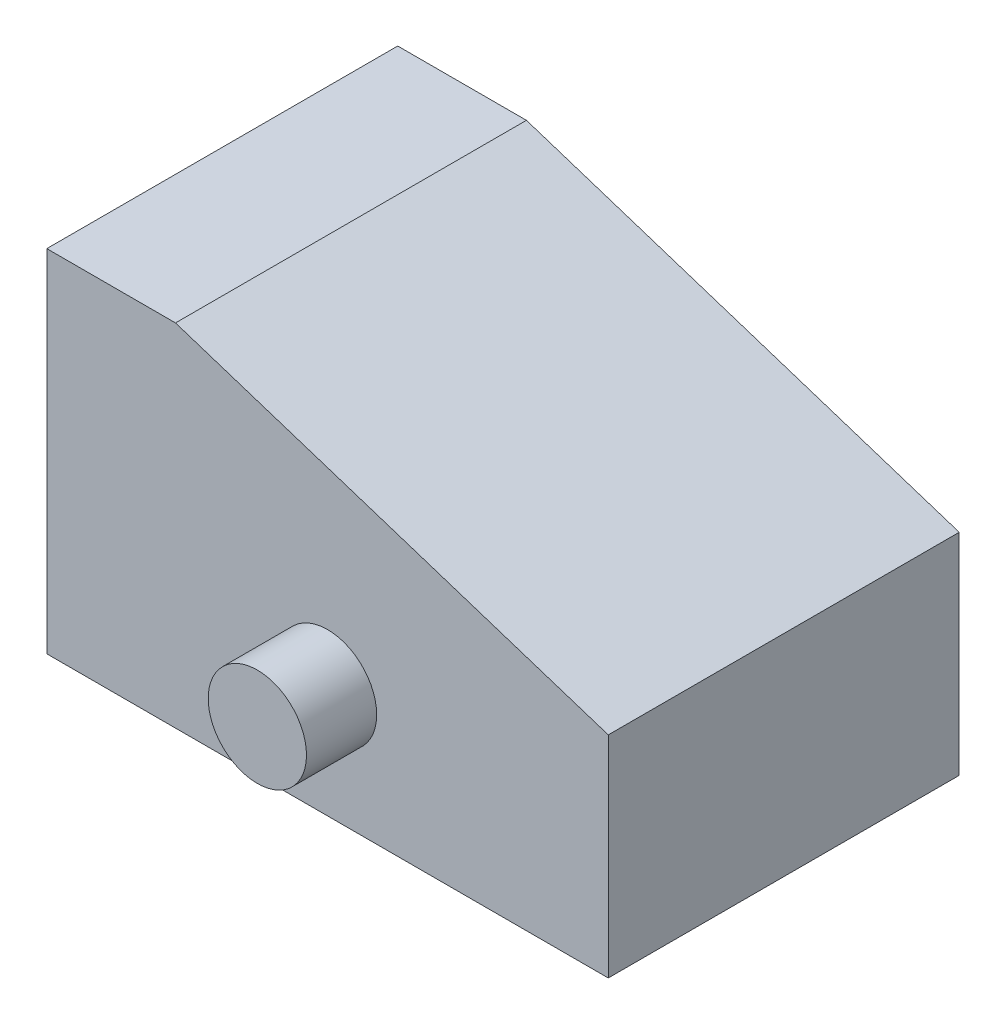
ISO-10303-21;
HEADER;
FILE_DESCRIPTION(('STEP AP214'),'2;1');
FILE_NAME('part.step','',(''),(''),'','','');
FILE_SCHEMA(('AUTOMOTIVE_DESIGN { 1 0 10303 214 1 1 1 1 }'));
ENDSEC;
DATA;
#1=APPLICATION_CONTEXT('core data for automotive mechanical design processes');
#2=APPLICATION_PROTOCOL_DEFINITION('international standard','automotive_design',2000,#1);
#3=PRODUCT_CONTEXT('',#1,'mechanical');
#4=PRODUCT('Part','Part','',(#3));
#5=PRODUCT_RELATED_PRODUCT_CATEGORY('part','',(#4));
#6=PRODUCT_DEFINITION_FORMATION('','',#4);
#7=PRODUCT_DEFINITION_CONTEXT('part definition',#1,'design');
#8=PRODUCT_DEFINITION('design','',#6,#7);
#9=PRODUCT_DEFINITION_SHAPE('','',#8);
#10=(LENGTH_UNIT() NAMED_UNIT(*) SI_UNIT(.MILLI.,.METRE.));
#11=(NAMED_UNIT(*) PLANE_ANGLE_UNIT() SI_UNIT($,.RADIAN.));
#12=(NAMED_UNIT(*) SI_UNIT($,.STERADIAN.) SOLID_ANGLE_UNIT());
#13=UNCERTAINTY_MEASURE_WITH_UNIT(LENGTH_MEASURE(1.E-05),#10,'distance_accuracy_value','');
#14=(GEOMETRIC_REPRESENTATION_CONTEXT(3) GLOBAL_UNCERTAINTY_ASSIGNED_CONTEXT((#13)) GLOBAL_UNIT_ASSIGNED_CONTEXT((#10,
#11,#12)) REPRESENTATION_CONTEXT('',''));
#15=CARTESIAN_POINT('',(0.,0.,0.));
#16=DIRECTION('',(0.,0.,1.));
#17=DIRECTION('',(1.,0.,0.));
#18=AXIS2_PLACEMENT_3D('',#15,#16,#17);
#19=CARTESIAN_POINT('',(0.,15.,0.));
#20=DIRECTION('',(1.,0.,0.));
#21=DIRECTION('',(0.,0.,-1.));
#22=AXIS2_PLACEMENT_3D('',#19,#20,#21);
#23=PLANE('',#22);
#24=DIRECTION('',(0.,0.,1.));
#25=VECTOR('',#24,1.);
#26=CARTESIAN_POINT('',(0.,0.,0.));
#27=LINE('',#26,#25);
#28=CARTESIAN_POINT('',(0.,0.,0.));
#29=VERTEX_POINT('',#28);
#30=CARTESIAN_POINT('',(0.,0.,25.));
#31=VERTEX_POINT('',#30);
#32=EDGE_CURVE('E177',#29,#31,#27,.T.);
#33=ORIENTED_EDGE('',*,*,#32,.T.);
#34=DIRECTION('',(0.,-1.,0.));
#35=VECTOR('',#34,1.);
#36=CARTESIAN_POINT('',(0.,15.,25.));
#37=LINE('',#36,#35);
#38=CARTESIAN_POINT('',(0.,25.,25.));
#39=VERTEX_POINT('',#38);
#40=EDGE_CURVE('E192',#39,#31,#37,.T.);
#41=ORIENTED_EDGE('',*,*,#40,.F.);
#42=DIRECTION('',(0.,0.,1.));
#43=VECTOR('',#42,1.);
#44=CARTESIAN_POINT('',(0.,25.,0.));
#45=LINE('',#44,#43);
#46=CARTESIAN_POINT('',(0.,25.,0.));
#47=VERTEX_POINT('',#46);
#48=EDGE_CURVE('E161',#47,#39,#45,.T.);
#49=ORIENTED_EDGE('',*,*,#48,.F.);
#50=DIRECTION('',(0.,-1.,0.));
#51=VECTOR('',#50,1.);
#52=CARTESIAN_POINT('',(0.,15.,0.));
#53=LINE('',#52,#51);
#54=EDGE_CURVE('E174',#47,#29,#53,.T.);
#55=ORIENTED_EDGE('',*,*,#54,.T.);
#56=EDGE_LOOP('',(#33,#41,#49,#55));
#57=FACE_BOUND('',#56,.T.);
#58=ADVANCED_FACE('F104',(#57),#23,.F.);
#59=CARTESIAN_POINT('',(0.,15.,25.));
#60=DIRECTION('',(0.,0.,-1.));
#61=DIRECTION('',(-1.,0.,0.));
#62=AXIS2_PLACEMENT_3D('',#59,#60,#61);
#63=PLANE('',#62);
#64=CARTESIAN_POINT('',(20.,8.,25.));
#65=DIRECTION('',(0.,0.,1.));
#66=DIRECTION('',(1.,0.,0.));
#67=AXIS2_PLACEMENT_3D('',#64,#65,#66);
#68=CIRCLE('',#67,3.5);
#69=CARTESIAN_POINT('',(23.5,8.,25.));
#70=VERTEX_POINT('',#69);
#71=EDGE_CURVE('E12',#70,#70,#68,.T.);
#72=ORIENTED_EDGE('',*,*,#71,.F.);
#73=EDGE_LOOP('',(#72));
#74=FACE_BOUND('',#73,.T.);
#75=DIRECTION('',(0.,-1.,0.));
#76=VECTOR('',#75,1.);
#77=CARTESIAN_POINT('',(40.,15.,25.));
#78=LINE('',#77,#76);
#79=CARTESIAN_POINT('',(40.,15.,25.));
#80=VERTEX_POINT('',#79);
#81=CARTESIAN_POINT('',(40.,0.,25.));
#82=VERTEX_POINT('',#81);
#83=EDGE_CURVE('E189',#80,#82,#78,.T.);
#84=ORIENTED_EDGE('',*,*,#83,.F.);
#85=DIRECTION('',(0.951214387347658,-0.308530694263667,0.));
#86=VECTOR('',#85,1.);
#87=CARTESIAN_POINT('',(24.5847689543855,20.,25.));
#88=LINE('',#87,#86);
#89=CARTESIAN_POINT('',(9.16953790877093,25.,25.));
#90=VERTEX_POINT('',#89);
#91=EDGE_CURVE('E165',#90,#80,#88,.T.);
#92=ORIENTED_EDGE('',*,*,#91,.F.);
#93=DIRECTION('',(1.,0.,0.));
#94=VECTOR('',#93,1.);
#95=CARTESIAN_POINT('',(0.,25.,25.));
#96=LINE('',#95,#94);
#97=EDGE_CURVE('E175',#39,#90,#96,.T.);
#98=ORIENTED_EDGE('',*,*,#97,.F.);
#99=ORIENTED_EDGE('',*,*,#40,.T.);
#100=DIRECTION('',(1.,0.,0.));
#101=VECTOR('',#100,1.);
#102=CARTESIAN_POINT('',(0.,0.,25.));
#103=LINE('',#102,#101);
#104=EDGE_CURVE('E176',#31,#82,#103,.T.);
#105=ORIENTED_EDGE('',*,*,#104,.T.);
#106=EDGE_LOOP('',(#84,#92,#98,#99,#105));
#107=FACE_BOUND('',#106,.T.);
#108=ADVANCED_FACE('F211',(#74,#107),#63,.F.);
#109=CARTESIAN_POINT('',(40.,15.,0.));
#110=DIRECTION('',(-1.,0.,0.));
#111=DIRECTION('',(0.,0.,1.));
#112=AXIS2_PLACEMENT_3D('',#109,#110,#111);
#113=PLANE('',#112);
#114=DIRECTION('',(0.,0.,-1.));
#115=VECTOR('',#114,1.);
#116=CARTESIAN_POINT('',(40.,0.,0.));
#117=LINE('',#116,#115);
#118=CARTESIAN_POINT('',(40.,0.,0.));
#119=VERTEX_POINT('',#118);
#120=EDGE_CURVE('E126',#82,#119,#117,.T.);
#121=ORIENTED_EDGE('',*,*,#120,.T.);
#122=DIRECTION('',(0.,-1.,0.));
#123=VECTOR('',#122,1.);
#124=CARTESIAN_POINT('',(40.,15.,0.));
#125=LINE('',#124,#123);
#126=CARTESIAN_POINT('',(40.,15.,0.));
#127=VERTEX_POINT('',#126);
#128=EDGE_CURVE('E187',#127,#119,#125,.T.);
#129=ORIENTED_EDGE('',*,*,#128,.F.);
#130=DIRECTION('',(0.,0.,-1.));
#131=VECTOR('',#130,1.);
#132=CARTESIAN_POINT('',(40.,15.,0.));
#133=LINE('',#132,#131);
#134=EDGE_CURVE('E157',#80,#127,#133,.T.);
#135=ORIENTED_EDGE('',*,*,#134,.F.);
#136=ORIENTED_EDGE('',*,*,#83,.T.);
#137=EDGE_LOOP('',(#121,#129,#135,#136));
#138=FACE_BOUND('',#137,.T.);
#139=ADVANCED_FACE('F203',(#138),#113,.F.);
#140=CARTESIAN_POINT('',(0.,15.,0.));
#141=DIRECTION('',(0.,0.,1.));
#142=DIRECTION('',(1.,0.,0.));
#143=AXIS2_PLACEMENT_3D('',#140,#141,#142);
#144=PLANE('',#143);
#145=CARTESIAN_POINT('',(20.,8.,0.));
#146=DIRECTION('',(0.,0.,1.));
#147=DIRECTION('',(1.,0.,0.));
#148=AXIS2_PLACEMENT_3D('',#145,#146,#147);
#149=CIRCLE('',#148,3.5);
#150=CARTESIAN_POINT('',(23.5,8.,0.));
#151=VERTEX_POINT('',#150);
#152=EDGE_CURVE('E107',#151,#151,#149,.F.);
#153=ORIENTED_EDGE('',*,*,#152,.F.);
#154=EDGE_LOOP('',(#153));
#155=FACE_BOUND('',#154,.T.);
#156=ORIENTED_EDGE('',*,*,#54,.F.);
#157=DIRECTION('',(-1.,0.,0.));
#158=VECTOR('',#157,1.);
#159=CARTESIAN_POINT('',(0.,25.,0.));
#160=LINE('',#159,#158);
#161=CARTESIAN_POINT('',(9.16953790877093,25.,0.));
#162=VERTEX_POINT('',#161);
#163=EDGE_CURVE('E166',#162,#47,#160,.T.);
#164=ORIENTED_EDGE('',*,*,#163,.F.);
#165=DIRECTION('',(0.951214387347658,-0.308530694263667,0.));
#166=VECTOR('',#165,1.);
#167=CARTESIAN_POINT('',(24.5847689543855,20.,0.));
#168=LINE('',#167,#166);
#169=EDGE_CURVE('E153',#162,#127,#168,.T.);
#170=ORIENTED_EDGE('',*,*,#169,.T.);
#171=ORIENTED_EDGE('',*,*,#128,.T.);
#172=DIRECTION('',(-1.,0.,0.));
#173=VECTOR('',#172,1.);
#174=CARTESIAN_POINT('',(0.,0.,0.));
#175=LINE('',#174,#173);
#176=EDGE_CURVE('E119',#119,#29,#175,.T.);
#177=ORIENTED_EDGE('',*,*,#176,.T.);
#178=EDGE_LOOP('',(#156,#164,#170,#171,#177));
#179=FACE_BOUND('',#178,.T.);
#180=ADVANCED_FACE('F173',(#155,#179),#144,.F.);
#181=CARTESIAN_POINT('',(0.,0.,0.));
#182=DIRECTION('',(0.,1.,0.));
#183=DIRECTION('',(0.,0.,1.));
#184=AXIS2_PLACEMENT_3D('',#181,#182,#183);
#185=PLANE('',#184);
#186=ORIENTED_EDGE('',*,*,#32,.F.);
#187=ORIENTED_EDGE('',*,*,#176,.F.);
#188=ORIENTED_EDGE('',*,*,#120,.F.);
#189=ORIENTED_EDGE('',*,*,#104,.F.);
#190=EDGE_LOOP('',(#186,#187,#188,#189));
#191=FACE_BOUND('',#190,.T.);
#192=ADVANCED_FACE('F199',(#191),#185,.F.);
#193=CARTESIAN_POINT('',(0.,25.,0.));
#194=DIRECTION('',(0.,1.,0.));
#195=DIRECTION('',(0.,0.,1.));
#196=AXIS2_PLACEMENT_3D('',#193,#194,#195);
#197=PLANE('',#196);
#198=ORIENTED_EDGE('',*,*,#48,.T.);
#199=ORIENTED_EDGE('',*,*,#97,.T.);
#200=DIRECTION('',(0.,0.,-1.));
#201=VECTOR('',#200,1.);
#202=CARTESIAN_POINT('',(9.16953790877093,25.,0.));
#203=LINE('',#202,#201);
#204=EDGE_CURVE('E156',#90,#162,#203,.T.);
#205=ORIENTED_EDGE('',*,*,#204,.T.);
#206=ORIENTED_EDGE('',*,*,#163,.T.);
#207=EDGE_LOOP('',(#198,#199,#205,#206));
#208=FACE_BOUND('',#207,.T.);
#209=ADVANCED_FACE('F169',(#208),#197,.T.);
#210=CARTESIAN_POINT('',(9.16953790877093,25.,0.));
#211=DIRECTION('',(0.308530694263667,0.951214387347658,0.));
#212=DIRECTION('',(0.,0.,1.));
#213=AXIS2_PLACEMENT_3D('',#210,#211,#212);
#214=PLANE('',#213);
#215=ORIENTED_EDGE('',*,*,#204,.F.);
#216=ORIENTED_EDGE('',*,*,#91,.T.);
#217=ORIENTED_EDGE('',*,*,#134,.T.);
#218=ORIENTED_EDGE('',*,*,#169,.F.);
#219=EDGE_LOOP('',(#215,#216,#217,#218));
#220=FACE_BOUND('',#219,.T.);
#221=ADVANCED_FACE('F154',(#220),#214,.T.);
#222=CARTESIAN_POINT('',(20.,8.,-5.));
#223=DIRECTION('',(0.,0.,1.));
#224=DIRECTION('',(1.,0.,0.));
#225=AXIS2_PLACEMENT_3D('',#222,#223,#224);
#226=CYLINDRICAL_SURFACE('',#225,3.5);
#227=CARTESIAN_POINT('',(20.,8.,-5.));
#228=DIRECTION('',(0.,0.,-1.));
#229=DIRECTION('',(-1.,0.,0.));
#230=AXIS2_PLACEMENT_3D('',#227,#228,#229);
#231=CIRCLE('',#230,3.5);
#232=CARTESIAN_POINT('',(16.5,8.,-5.));
#233=VERTEX_POINT('',#232);
#234=EDGE_CURVE('E222',#233,#233,#231,.T.);
#235=ORIENTED_EDGE('',*,*,#234,.F.);
#236=EDGE_LOOP('',(#235));
#237=FACE_BOUND('',#236,.T.);
#238=ORIENTED_EDGE('',*,*,#152,.T.);
#239=EDGE_LOOP('',(#238));
#240=FACE_BOUND('',#239,.T.);
#241=ADVANCED_FACE('F197',(#237,#240),#226,.T.);
#242=CARTESIAN_POINT('',(20.,8.,-5.));
#243=DIRECTION('',(0.,0.,-1.));
#244=DIRECTION('',(-1.,0.,0.));
#245=AXIS2_PLACEMENT_3D('',#242,#243,#244);
#246=PLANE('',#245);
#247=ORIENTED_EDGE('',*,*,#234,.T.);
#248=EDGE_LOOP('',(#247));
#249=FACE_BOUND('',#248,.T.);
#250=ADVANCED_FACE('F237',(#249),#246,.T.);
#251=CARTESIAN_POINT('',(20.,8.,30.));
#252=DIRECTION('',(0.,0.,-1.));
#253=DIRECTION('',(-1.,0.,0.));
#254=AXIS2_PLACEMENT_3D('',#251,#252,#253);
#255=CYLINDRICAL_SURFACE('',#254,3.5);
#256=CARTESIAN_POINT('',(20.,8.,30.));
#257=DIRECTION('',(0.,0.,1.));
#258=DIRECTION('',(1.,0.,0.));
#259=AXIS2_PLACEMENT_3D('',#256,#257,#258);
#260=CIRCLE('',#259,3.5);
#261=CARTESIAN_POINT('',(23.5,8.,30.));
#262=VERTEX_POINT('',#261);
#263=EDGE_CURVE('E221',#262,#262,#260,.T.);
#264=ORIENTED_EDGE('',*,*,#263,.F.);
#265=EDGE_LOOP('',(#264));
#266=FACE_BOUND('',#265,.T.);
#267=ORIENTED_EDGE('',*,*,#71,.T.);
#268=EDGE_LOOP('',(#267));
#269=FACE_BOUND('',#268,.T.);
#270=ADVANCED_FACE('F235',(#266,#269),#255,.T.);
#271=CARTESIAN_POINT('',(0.,0.,30.));
#272=DIRECTION('',(0.,0.,1.));
#273=DIRECTION('',(1.,0.,0.));
#274=AXIS2_PLACEMENT_3D('',#271,#272,#273);
#275=PLANE('',#274);
#276=ORIENTED_EDGE('',*,*,#263,.T.);
#277=EDGE_LOOP('',(#276));
#278=FACE_BOUND('',#277,.T.);
#279=ADVANCED_FACE('F232',(#278),#275,.T.);
#280=CLOSED_SHELL('',(#58,#108,#139,#180,#192,#209,#221,#241,#250,#270,#279));
#281=MANIFOLD_SOLID_BREP('B2',#280);
#282=ADVANCED_BREP_SHAPE_REPRESENTATION('',(#18,#281),#14);
#283=SHAPE_DEFINITION_REPRESENTATION(#9,#282);
ENDSEC;
END-ISO-10303-21;
